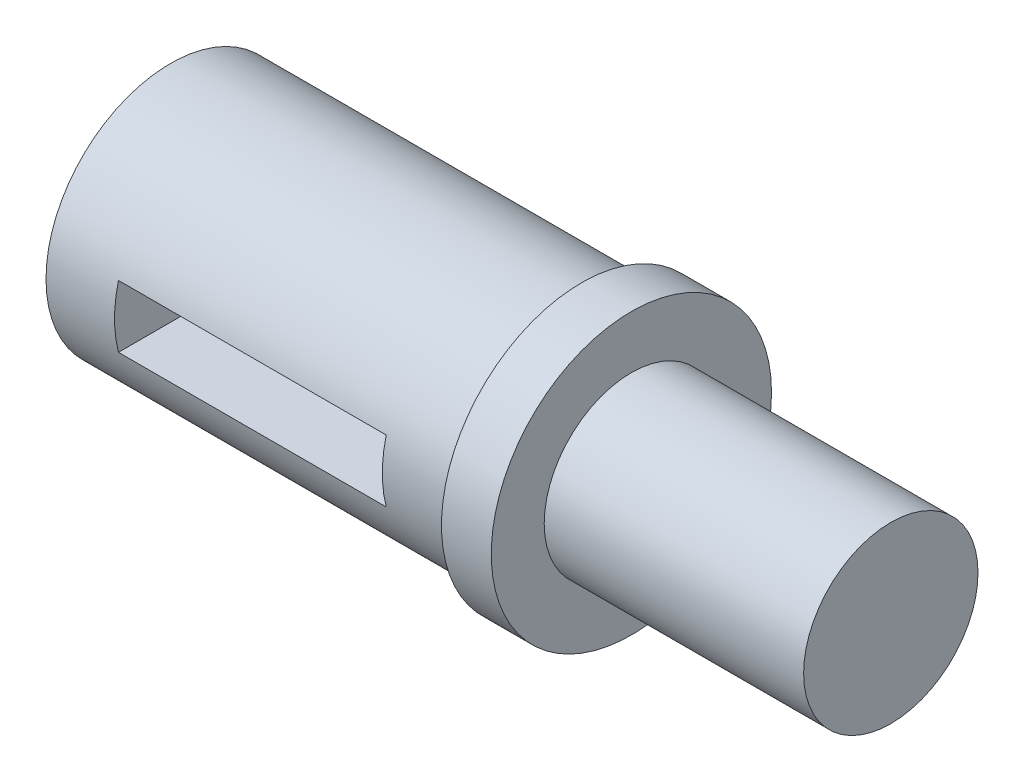
ISO-10303-21;
HEADER;
FILE_DESCRIPTION(('STEP AP214'),'2;1');
FILE_NAME('part.step','',(''),(''),'','','');
FILE_SCHEMA(('AUTOMOTIVE_DESIGN { 1 0 10303 214 1 1 1 1 }'));
ENDSEC;
DATA;
#1=APPLICATION_CONTEXT('core data for automotive mechanical design processes');
#2=APPLICATION_PROTOCOL_DEFINITION('international standard','automotive_design',2000,#1);
#3=PRODUCT_CONTEXT('',#1,'mechanical');
#4=PRODUCT('Part','Part','',(#3));
#5=PRODUCT_RELATED_PRODUCT_CATEGORY('part','',(#4));
#6=PRODUCT_DEFINITION_FORMATION('','',#4);
#7=PRODUCT_DEFINITION_CONTEXT('part definition',#1,'design');
#8=PRODUCT_DEFINITION('design','',#6,#7);
#9=PRODUCT_DEFINITION_SHAPE('','',#8);
#10=(LENGTH_UNIT() NAMED_UNIT(*) SI_UNIT(.MILLI.,.METRE.));
#11=(NAMED_UNIT(*) PLANE_ANGLE_UNIT() SI_UNIT($,.RADIAN.));
#12=(NAMED_UNIT(*) SI_UNIT($,.STERADIAN.) SOLID_ANGLE_UNIT());
#13=UNCERTAINTY_MEASURE_WITH_UNIT(LENGTH_MEASURE(1.E-05),#10,'distance_accuracy_value','');
#14=(GEOMETRIC_REPRESENTATION_CONTEXT(3) GLOBAL_UNCERTAINTY_ASSIGNED_CONTEXT((#13)) GLOBAL_UNIT_ASSIGNED_CONTEXT((#10,
#11,#12)) REPRESENTATION_CONTEXT('',''));
#15=CARTESIAN_POINT('',(0.,0.,0.));
#16=DIRECTION('',(0.,0.,1.));
#17=DIRECTION('',(1.,0.,0.));
#18=AXIS2_PLACEMENT_3D('',#15,#16,#17);
#19=CARTESIAN_POINT('',(60.1714285714286,0.,-14.));
#20=DIRECTION('',(-1.,0.,0.));
#21=DIRECTION('',(0.,0.,1.));
#22=AXIS2_PLACEMENT_3D('',#19,#20,#21);
#23=PLANE('',#22);
#24=CARTESIAN_POINT('',(60.1714285714286,0.,0.));
#25=DIRECTION('',(1.,0.,0.));
#26=DIRECTION('',(0.,0.,-1.));
#27=AXIS2_PLACEMENT_3D('',#24,#25,#26);
#28=CIRCLE('',#27,14.);
#29=CARTESIAN_POINT('',(60.1714285714286,0.,-14.));
#30=VERTEX_POINT('',#29);
#31=EDGE_CURVE('E120',#30,#30,#28,.T.);
#32=ORIENTED_EDGE('',*,*,#31,.T.);
#33=EDGE_LOOP('',(#32));
#34=FACE_BOUND('',#33,.T.);
#35=ADVANCED_FACE('F39',(#34),#23,.F.);
#36=CARTESIAN_POINT('',(-55.4857142857143,0.,0.));
#37=DIRECTION('',(1.,0.,0.));
#38=DIRECTION('',(0.,0.,-1.));
#39=AXIS2_PLACEMENT_3D('',#36,#37,#38);
#40=PLANE('',#39);
#41=CARTESIAN_POINT('',(-55.4857142857143,0.,0.));
#42=DIRECTION('',(1.,0.,0.));
#43=DIRECTION('',(0.,0.,-1.));
#44=AXIS2_PLACEMENT_3D('',#41,#42,#43);
#45=CIRCLE('',#44,20.);
#46=CARTESIAN_POINT('',(-55.4857142857143,0.,-20.));
#47=VERTEX_POINT('',#46);
#48=EDGE_CURVE('E86',#47,#47,#45,.T.);
#49=ORIENTED_EDGE('',*,*,#48,.F.);
#50=EDGE_LOOP('',(#49));
#51=FACE_BOUND('',#50,.T.);
#52=ADVANCED_FACE('F151',(#51),#40,.F.);
#53=CARTESIAN_POINT('',(60.1714285714286,0.,0.));
#54=DIRECTION('',(1.,0.,0.));
#55=DIRECTION('',(0.,0.,-1.));
#56=AXIS2_PLACEMENT_3D('',#53,#54,#55);
#57=CYLINDRICAL_SURFACE('',#56,20.);
#58=DIRECTION('',(1.,0.,0.));
#59=VECTOR('',#58,1.);
#60=CARTESIAN_POINT('',(60.1714285714286,5.,-19.3649167310371));
#61=LINE('',#60,#59);
#62=CARTESIAN_POINT('',(-1.48571428571428,5.,-19.3649167310371));
#63=VERTEX_POINT('',#62);
#64=CARTESIAN_POINT('',(-44.4857142857143,5.,-19.3649167310371));
#65=VERTEX_POINT('',#64);
#66=EDGE_CURVE('E42',#63,#65,#61,.F.);
#67=ORIENTED_EDGE('',*,*,#66,.T.);
#68=CARTESIAN_POINT('',(-44.4857142857143,0.,0.));
#69=DIRECTION('',(-1.,0.,0.));
#70=DIRECTION('',(0.,0.,1.));
#71=AXIS2_PLACEMENT_3D('',#68,#69,#70);
#72=CIRCLE('',#71,20.);
#73=CARTESIAN_POINT('',(-44.4857142857143,-5.,-19.3649167310371));
#74=VERTEX_POINT('',#73);
#75=EDGE_CURVE('E11',#65,#74,#72,.T.);
#76=ORIENTED_EDGE('',*,*,#75,.T.);
#77=DIRECTION('',(1.,0.,0.));
#78=VECTOR('',#77,1.);
#79=CARTESIAN_POINT('',(60.1714285714286,-5.,-19.3649167310371));
#80=LINE('',#79,#78);
#81=CARTESIAN_POINT('',(-1.48571428571428,-5.,-19.3649167310371));
#82=VERTEX_POINT('',#81);
#83=EDGE_CURVE('E107',#74,#82,#80,.T.);
#84=ORIENTED_EDGE('',*,*,#83,.T.);
#85=CARTESIAN_POINT('',(-1.48571428571428,0.,0.));
#86=DIRECTION('',(1.,0.,0.));
#87=DIRECTION('',(0.,0.,-1.));
#88=AXIS2_PLACEMENT_3D('',#85,#86,#87);
#89=CIRCLE('',#88,20.);
#90=EDGE_CURVE('E93',#82,#63,#89,.T.);
#91=ORIENTED_EDGE('',*,*,#90,.T.);
#92=EDGE_LOOP('',(#67,#76,#84,#91));
#93=FACE_BOUND('',#92,.T.);
#94=DIRECTION('',(1.,0.,0.));
#95=VECTOR('',#94,1.);
#96=CARTESIAN_POINT('',(60.1714285714286,-5.,19.3649167310371));
#97=LINE('',#96,#95);
#98=CARTESIAN_POINT('',(-1.48571428571428,-5.,19.3649167310371));
#99=VERTEX_POINT('',#98);
#100=CARTESIAN_POINT('',(-44.4857142857143,-5.,19.3649167310371));
#101=VERTEX_POINT('',#100);
#102=EDGE_CURVE('E79',#99,#101,#97,.F.);
#103=ORIENTED_EDGE('',*,*,#102,.T.);
#104=CARTESIAN_POINT('',(-44.4857142857143,5.,19.3649167310371));
#105=VERTEX_POINT('',#104);
#106=EDGE_CURVE('E49',#101,#105,#72,.T.);
#107=ORIENTED_EDGE('',*,*,#106,.T.);
#108=DIRECTION('',(1.,0.,0.));
#109=VECTOR('',#108,1.);
#110=CARTESIAN_POINT('',(60.1714285714286,5.,19.3649167310371));
#111=LINE('',#110,#109);
#112=CARTESIAN_POINT('',(-1.48571428571428,5.,19.3649167310371));
#113=VERTEX_POINT('',#112);
#114=EDGE_CURVE('E101',#105,#113,#111,.T.);
#115=ORIENTED_EDGE('',*,*,#114,.T.);
#116=EDGE_CURVE('E85',#113,#99,#89,.T.);
#117=ORIENTED_EDGE('',*,*,#116,.T.);
#118=EDGE_LOOP('',(#103,#107,#115,#117));
#119=FACE_BOUND('',#118,.T.);
#120=CARTESIAN_POINT('',(10.5142857142857,0.,0.));
#121=DIRECTION('',(1.,0.,0.));
#122=DIRECTION('',(0.,0.,-1.));
#123=AXIS2_PLACEMENT_3D('',#120,#121,#122);
#124=CIRCLE('',#123,20.);
#125=CARTESIAN_POINT('',(10.5142857142857,0.,-20.));
#126=VERTEX_POINT('',#125);
#127=EDGE_CURVE('E142',#126,#126,#124,.T.);
#128=ORIENTED_EDGE('',*,*,#127,.F.);
#129=EDGE_LOOP('',(#128));
#130=FACE_BOUND('',#129,.T.);
#131=ORIENTED_EDGE('',*,*,#48,.T.);
#132=EDGE_LOOP('',(#131));
#133=FACE_BOUND('',#132,.T.);
#134=ADVANCED_FACE('F99',(#93,#119,#130,#133),#57,.T.);
#135=CARTESIAN_POINT('',(10.5142857142857,0.,-20.));
#136=DIRECTION('',(1.,0.,0.));
#137=DIRECTION('',(0.,0.,-1.));
#138=AXIS2_PLACEMENT_3D('',#135,#136,#137);
#139=PLANE('',#138);
#140=CARTESIAN_POINT('',(10.5142857142857,0.,0.));
#141=DIRECTION('',(1.,0.,0.));
#142=DIRECTION('',(0.,0.,-1.));
#143=AXIS2_PLACEMENT_3D('',#140,#141,#142);
#144=CIRCLE('',#143,22.5);
#145=CARTESIAN_POINT('',(10.5142857142857,0.,-22.5));
#146=VERTEX_POINT('',#145);
#147=EDGE_CURVE('E138',#146,#146,#144,.T.);
#148=ORIENTED_EDGE('',*,*,#147,.F.);
#149=EDGE_LOOP('',(#148));
#150=FACE_BOUND('',#149,.T.);
#151=ORIENTED_EDGE('',*,*,#127,.T.);
#152=EDGE_LOOP('',(#151));
#153=FACE_BOUND('',#152,.T.);
#154=ADVANCED_FACE('F157',(#150,#153),#139,.F.);
#155=CARTESIAN_POINT('',(60.1714285714286,0.,0.));
#156=DIRECTION('',(1.,0.,0.));
#157=DIRECTION('',(0.,0.,-1.));
#158=AXIS2_PLACEMENT_3D('',#155,#156,#157);
#159=CYLINDRICAL_SURFACE('',#158,22.5);
#160=CARTESIAN_POINT('',(18.5142857142857,0.,0.));
#161=DIRECTION('',(1.,0.,0.));
#162=DIRECTION('',(0.,0.,-1.));
#163=AXIS2_PLACEMENT_3D('',#160,#161,#162);
#164=CIRCLE('',#163,22.5);
#165=CARTESIAN_POINT('',(18.5142857142857,0.,-22.5));
#166=VERTEX_POINT('',#165);
#167=EDGE_CURVE('E134',#166,#166,#164,.T.);
#168=ORIENTED_EDGE('',*,*,#167,.F.);
#169=EDGE_LOOP('',(#168));
#170=FACE_BOUND('',#169,.T.);
#171=ORIENTED_EDGE('',*,*,#147,.T.);
#172=EDGE_LOOP('',(#171));
#173=FACE_BOUND('',#172,.T.);
#174=ADVANCED_FACE('F163',(#170,#173),#159,.T.);
#175=CARTESIAN_POINT('',(18.5142857142857,0.,-22.5));
#176=DIRECTION('',(-1.,0.,0.));
#177=DIRECTION('',(0.,0.,1.));
#178=AXIS2_PLACEMENT_3D('',#175,#176,#177);
#179=PLANE('',#178);
#180=CARTESIAN_POINT('',(18.5142857142857,0.,0.));
#181=DIRECTION('',(1.,0.,0.));
#182=DIRECTION('',(0.,0.,-1.));
#183=AXIS2_PLACEMENT_3D('',#180,#181,#182);
#184=CIRCLE('',#183,14.);
#185=CARTESIAN_POINT('',(18.5142857142857,0.,-14.));
#186=VERTEX_POINT('',#185);
#187=EDGE_CURVE('E125',#186,#186,#184,.T.);
#188=ORIENTED_EDGE('',*,*,#187,.F.);
#189=EDGE_LOOP('',(#188));
#190=FACE_BOUND('',#189,.T.);
#191=ORIENTED_EDGE('',*,*,#167,.T.);
#192=EDGE_LOOP('',(#191));
#193=FACE_BOUND('',#192,.T.);
#194=ADVANCED_FACE('F167',(#190,#193),#179,.F.);
#195=CARTESIAN_POINT('',(60.1714285714286,0.,0.));
#196=DIRECTION('',(1.,0.,0.));
#197=DIRECTION('',(0.,0.,-1.));
#198=AXIS2_PLACEMENT_3D('',#195,#196,#197);
#199=CYLINDRICAL_SURFACE('',#198,14.);
#200=ORIENTED_EDGE('',*,*,#31,.F.);
#201=EDGE_LOOP('',(#200));
#202=FACE_BOUND('',#201,.T.);
#203=ORIENTED_EDGE('',*,*,#187,.T.);
#204=EDGE_LOOP('',(#203));
#205=FACE_BOUND('',#204,.T.);
#206=ADVANCED_FACE('F171',(#202,#205),#199,.T.);
#207=CARTESIAN_POINT('',(-44.4857142857143,5.,-22.5));
#208=DIRECTION('',(-1.,0.,0.));
#209=DIRECTION('',(0.,0.,1.));
#210=AXIS2_PLACEMENT_3D('',#207,#208,#209);
#211=PLANE('',#210);
#212=DIRECTION('',(0.,0.,1.));
#213=VECTOR('',#212,1.);
#214=CARTESIAN_POINT('',(-44.4857142857143,5.,-22.5));
#215=LINE('',#214,#213);
#216=EDGE_CURVE('E117',#65,#105,#215,.T.);
#217=ORIENTED_EDGE('',*,*,#216,.T.);
#218=ORIENTED_EDGE('',*,*,#106,.F.);
#219=DIRECTION('',(0.,0.,1.));
#220=VECTOR('',#219,1.);
#221=CARTESIAN_POINT('',(-44.4857142857143,-5.,-22.5));
#222=LINE('',#221,#220);
#223=EDGE_CURVE('E61',#74,#101,#222,.T.);
#224=ORIENTED_EDGE('',*,*,#223,.F.);
#225=ORIENTED_EDGE('',*,*,#75,.F.);
#226=EDGE_LOOP('',(#217,#218,#224,#225));
#227=FACE_BOUND('',#226,.T.);
#228=ADVANCED_FACE('F115',(#227),#211,.F.);
#229=CARTESIAN_POINT('',(-44.4857142857143,5.,-22.5));
#230=DIRECTION('',(0.,1.,0.));
#231=DIRECTION('',(0.,0.,1.));
#232=AXIS2_PLACEMENT_3D('',#229,#230,#231);
#233=PLANE('',#232);
#234=ORIENTED_EDGE('',*,*,#216,.F.);
#235=ORIENTED_EDGE('',*,*,#66,.F.);
#236=DIRECTION('',(0.,0.,1.));
#237=VECTOR('',#236,1.);
#238=CARTESIAN_POINT('',(-1.48571428571428,5.,-22.5));
#239=LINE('',#238,#237);
#240=EDGE_CURVE('E96',#63,#113,#239,.T.);
#241=ORIENTED_EDGE('',*,*,#240,.T.);
#242=ORIENTED_EDGE('',*,*,#114,.F.);
#243=EDGE_LOOP('',(#234,#235,#241,#242));
#244=FACE_BOUND('',#243,.T.);
#245=ADVANCED_FACE('F178',(#244),#233,.F.);
#246=CARTESIAN_POINT('',(-1.48571428571428,5.,-22.5));
#247=DIRECTION('',(1.,0.,0.));
#248=DIRECTION('',(0.,0.,-1.));
#249=AXIS2_PLACEMENT_3D('',#246,#247,#248);
#250=PLANE('',#249);
#251=ORIENTED_EDGE('',*,*,#240,.F.);
#252=ORIENTED_EDGE('',*,*,#90,.F.);
#253=DIRECTION('',(0.,0.,1.));
#254=VECTOR('',#253,1.);
#255=CARTESIAN_POINT('',(-1.48571428571428,-5.,-22.5));
#256=LINE('',#255,#254);
#257=EDGE_CURVE('E56',#82,#99,#256,.T.);
#258=ORIENTED_EDGE('',*,*,#257,.T.);
#259=ORIENTED_EDGE('',*,*,#116,.F.);
#260=EDGE_LOOP('',(#251,#252,#258,#259));
#261=FACE_BOUND('',#260,.T.);
#262=ADVANCED_FACE('F90',(#261),#250,.F.);
#263=CARTESIAN_POINT('',(-44.4857142857143,-5.,-22.5));
#264=DIRECTION('',(0.,-1.,0.));
#265=DIRECTION('',(0.,0.,-1.));
#266=AXIS2_PLACEMENT_3D('',#263,#264,#265);
#267=PLANE('',#266);
#268=ORIENTED_EDGE('',*,*,#223,.T.);
#269=ORIENTED_EDGE('',*,*,#102,.F.);
#270=ORIENTED_EDGE('',*,*,#257,.F.);
#271=ORIENTED_EDGE('',*,*,#83,.F.);
#272=EDGE_LOOP('',(#268,#269,#270,#271));
#273=FACE_BOUND('',#272,.T.);
#274=ADVANCED_FACE('F80',(#273),#267,.F.);
#275=CLOSED_SHELL('',(#35,#52,#134,#154,#174,#194,#206,#228,#245,#262,#274));
#276=MANIFOLD_SOLID_BREP('B2',#275);
#277=ADVANCED_BREP_SHAPE_REPRESENTATION('',(#18,#276),#14);
#278=SHAPE_DEFINITION_REPRESENTATION(#9,#277);
ENDSEC;
END-ISO-10303-21;
